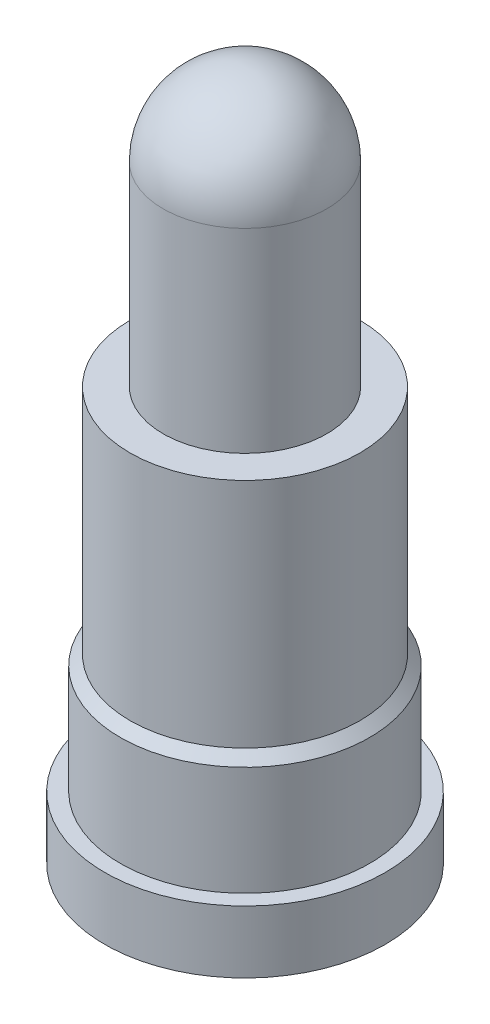
ISO-10303-21;
HEADER;
FILE_DESCRIPTION(('STEP AP214'),'2;1');
FILE_NAME('part.step','',(''),(''),'','','');
FILE_SCHEMA(('AUTOMOTIVE_DESIGN { 1 0 10303 214 1 1 1 1 }'));
ENDSEC;
DATA;
#1=APPLICATION_CONTEXT('core data for automotive mechanical design processes');
#2=APPLICATION_PROTOCOL_DEFINITION('international standard','automotive_design',2000,#1);
#3=PRODUCT_CONTEXT('',#1,'mechanical');
#4=PRODUCT('Part','Part','',(#3));
#5=PRODUCT_RELATED_PRODUCT_CATEGORY('part','',(#4));
#6=PRODUCT_DEFINITION_FORMATION('','',#4);
#7=PRODUCT_DEFINITION_CONTEXT('part definition',#1,'design');
#8=PRODUCT_DEFINITION('design','',#6,#7);
#9=PRODUCT_DEFINITION_SHAPE('','',#8);
#10=(LENGTH_UNIT() NAMED_UNIT(*) SI_UNIT(.MILLI.,.METRE.));
#11=(NAMED_UNIT(*) PLANE_ANGLE_UNIT() SI_UNIT($,.RADIAN.));
#12=(NAMED_UNIT(*) SI_UNIT($,.STERADIAN.) SOLID_ANGLE_UNIT());
#13=UNCERTAINTY_MEASURE_WITH_UNIT(LENGTH_MEASURE(1.E-05),#10,'distance_accuracy_value','');
#14=(GEOMETRIC_REPRESENTATION_CONTEXT(3) GLOBAL_UNCERTAINTY_ASSIGNED_CONTEXT((#13)) GLOBAL_UNIT_ASSIGNED_CONTEXT((#10,
#11,#12)) REPRESENTATION_CONTEXT('',''));
#15=CARTESIAN_POINT('',(0.,0.,0.));
#16=DIRECTION('',(0.,0.,1.));
#17=DIRECTION('',(1.,0.,0.));
#18=AXIS2_PLACEMENT_3D('',#15,#16,#17);
#19=CARTESIAN_POINT('',(0.,3.9624,0.));
#20=DIRECTION('',(0.,1.,0.));
#21=DIRECTION('',(-1.,0.,0.));
#22=AXIS2_PLACEMENT_3D('',#19,#20,#21);
#23=SPHERICAL_SURFACE('',#22,0.5334);
#24=CARTESIAN_POINT('',(0.,3.9624,0.));
#25=DIRECTION('',(0.,1.,0.));
#26=DIRECTION('',(-1.,0.,0.));
#27=AXIS2_PLACEMENT_3D('',#24,#25,#26);
#28=CIRCLE('',#27,0.533400000000001);
#29=CARTESIAN_POINT('',(-0.5334,3.9624,0.));
#30=VERTEX_POINT('',#29);
#31=EDGE_CURVE('E10',#30,#30,#28,.T.);
#32=ORIENTED_EDGE('',*,*,#31,.T.);
#33=EDGE_LOOP('',(#32));
#34=FACE_BOUND('',#33,.T.);
#35=ADVANCED_FACE('F36',(#34),#23,.T.);
#36=CARTESIAN_POINT('',(0.,3.9624,0.));
#37=DIRECTION('',(0.,1.,0.));
#38=DIRECTION('',(-1.,0.,0.));
#39=AXIS2_PLACEMENT_3D('',#36,#37,#38);
#40=CYLINDRICAL_SURFACE('',#39,0.533400000000001);
#41=ORIENTED_EDGE('',*,*,#31,.F.);
#42=EDGE_LOOP('',(#41));
#43=FACE_BOUND('',#42,.T.);
#44=CARTESIAN_POINT('',(0.,2.6924,0.));
#45=DIRECTION('',(0.,1.,0.));
#46=DIRECTION('',(-1.,0.,0.));
#47=AXIS2_PLACEMENT_3D('',#44,#45,#46);
#48=CIRCLE('',#47,0.533400000000001);
#49=CARTESIAN_POINT('',(-0.5334,2.6924,0.));
#50=VERTEX_POINT('',#49);
#51=EDGE_CURVE('E42',#50,#50,#48,.T.);
#52=ORIENTED_EDGE('',*,*,#51,.T.);
#53=EDGE_LOOP('',(#52));
#54=FACE_BOUND('',#53,.T.);
#55=ADVANCED_FACE('F80',(#43,#54),#40,.T.);
#56=CARTESIAN_POINT('',(0.,2.6924,0.));
#57=DIRECTION('',(0.,-1.,0.));
#58=DIRECTION('',(1.,0.,0.));
#59=AXIS2_PLACEMENT_3D('',#56,#57,#58);
#60=PLANE('',#59);
#61=ORIENTED_EDGE('',*,*,#51,.F.);
#62=EDGE_LOOP('',(#61));
#63=FACE_BOUND('',#62,.T.);
#64=CARTESIAN_POINT('',(0.,2.6924,0.));
#65=DIRECTION('',(0.,1.,0.));
#66=DIRECTION('',(-1.,0.,0.));
#67=AXIS2_PLACEMENT_3D('',#64,#65,#66);
#68=CIRCLE('',#67,0.7493);
#69=CARTESIAN_POINT('',(-0.7493,2.6924,0.));
#70=VERTEX_POINT('',#69);
#71=EDGE_CURVE('E46',#70,#70,#68,.T.);
#72=ORIENTED_EDGE('',*,*,#71,.T.);
#73=EDGE_LOOP('',(#72));
#74=FACE_BOUND('',#73,.T.);
#75=ADVANCED_FACE('F84',(#63,#74),#60,.F.);
#76=CARTESIAN_POINT('',(0.,3.9624,0.));
#77=DIRECTION('',(0.,1.,0.));
#78=DIRECTION('',(-1.,0.,0.));
#79=AXIS2_PLACEMENT_3D('',#76,#77,#78);
#80=CYLINDRICAL_SURFACE('',#79,0.7493);
#81=ORIENTED_EDGE('',*,*,#71,.F.);
#82=EDGE_LOOP('',(#81));
#83=FACE_BOUND('',#82,.T.);
#84=CARTESIAN_POINT('',(0.,1.1811,0.));
#85=DIRECTION('',(0.,1.,0.));
#86=DIRECTION('',(-1.,0.,0.));
#87=AXIS2_PLACEMENT_3D('',#84,#85,#86);
#88=CIRCLE('',#87,0.7493);
#89=CARTESIAN_POINT('',(-0.7493,1.1811,0.));
#90=VERTEX_POINT('',#89);
#91=EDGE_CURVE('E50',#90,#90,#88,.T.);
#92=ORIENTED_EDGE('',*,*,#91,.T.);
#93=EDGE_LOOP('',(#92));
#94=FACE_BOUND('',#93,.T.);
#95=ADVANCED_FACE('F89',(#83,#94),#80,.T.);
#96=CARTESIAN_POINT('',(0.,1.1176,0.));
#97=DIRECTION('',(0.,-1.,0.));
#98=DIRECTION('',(1.,0.,0.));
#99=AXIS2_PLACEMENT_3D('',#96,#97,#98);
#100=CONICAL_SURFACE('',#99,0.8128,0.785398163397447);
#101=ORIENTED_EDGE('',*,*,#91,.F.);
#102=EDGE_LOOP('',(#101));
#103=FACE_BOUND('',#102,.T.);
#104=CARTESIAN_POINT('',(0.,1.1176,0.));
#105=DIRECTION('',(0.,1.,0.));
#106=DIRECTION('',(-1.,0.,0.));
#107=AXIS2_PLACEMENT_3D('',#104,#105,#106);
#108=CIRCLE('',#107,0.8128);
#109=CARTESIAN_POINT('',(-0.8128,1.1176,0.));
#110=VERTEX_POINT('',#109);
#111=EDGE_CURVE('E55',#110,#110,#108,.T.);
#112=ORIENTED_EDGE('',*,*,#111,.T.);
#113=EDGE_LOOP('',(#112));
#114=FACE_BOUND('',#113,.T.);
#115=ADVANCED_FACE('F95',(#103,#114),#100,.T.);
#116=CARTESIAN_POINT('',(0.,3.9624,0.));
#117=DIRECTION('',(0.,1.,0.));
#118=DIRECTION('',(-1.,0.,0.));
#119=AXIS2_PLACEMENT_3D('',#116,#117,#118);
#120=CYLINDRICAL_SURFACE('',#119,0.8128);
#121=ORIENTED_EDGE('',*,*,#111,.F.);
#122=EDGE_LOOP('',(#121));
#123=FACE_BOUND('',#122,.T.);
#124=CARTESIAN_POINT('',(0.,0.4064,0.));
#125=DIRECTION('',(0.,1.,0.));
#126=DIRECTION('',(-1.,0.,0.));
#127=AXIS2_PLACEMENT_3D('',#124,#125,#126);
#128=CIRCLE('',#127,0.8128);
#129=CARTESIAN_POINT('',(-0.8128,0.4064,0.));
#130=VERTEX_POINT('',#129);
#131=EDGE_CURVE('E58',#130,#130,#128,.T.);
#132=ORIENTED_EDGE('',*,*,#131,.T.);
#133=EDGE_LOOP('',(#132));
#134=FACE_BOUND('',#133,.T.);
#135=ADVANCED_FACE('F99',(#123,#134),#120,.T.);
#136=CARTESIAN_POINT('',(0.,0.4064,0.));
#137=DIRECTION('',(0.,-1.,0.));
#138=DIRECTION('',(1.,0.,0.));
#139=AXIS2_PLACEMENT_3D('',#136,#137,#138);
#140=PLANE('',#139);
#141=ORIENTED_EDGE('',*,*,#131,.F.);
#142=EDGE_LOOP('',(#141));
#143=FACE_BOUND('',#142,.T.);
#144=CARTESIAN_POINT('',(0.,0.406399999999999,0.));
#145=DIRECTION('',(0.,1.,0.));
#146=DIRECTION('',(-1.,0.,0.));
#147=AXIS2_PLACEMENT_3D('',#144,#145,#146);
#148=CIRCLE('',#147,0.9144);
#149=CARTESIAN_POINT('',(-0.9144,0.4064,0.));
#150=VERTEX_POINT('',#149);
#151=EDGE_CURVE('E61',#150,#150,#148,.T.);
#152=ORIENTED_EDGE('',*,*,#151,.T.);
#153=EDGE_LOOP('',(#152));
#154=FACE_BOUND('',#153,.T.);
#155=ADVANCED_FACE('F76',(#143,#154),#140,.F.);
#156=CARTESIAN_POINT('',(0.,3.9624,0.));
#157=DIRECTION('',(0.,1.,0.));
#158=DIRECTION('',(-1.,0.,0.));
#159=AXIS2_PLACEMENT_3D('',#156,#157,#158);
#160=CYLINDRICAL_SURFACE('',#159,0.9144);
#161=ORIENTED_EDGE('',*,*,#151,.F.);
#162=EDGE_LOOP('',(#161));
#163=FACE_BOUND('',#162,.T.);
#164=CARTESIAN_POINT('',(0.,0.,0.));
#165=DIRECTION('',(0.,1.,0.));
#166=DIRECTION('',(-1.,0.,0.));
#167=AXIS2_PLACEMENT_3D('',#164,#165,#166);
#168=CIRCLE('',#167,0.9144);
#169=CARTESIAN_POINT('',(-0.9144,0.,0.));
#170=VERTEX_POINT('',#169);
#171=EDGE_CURVE('E64',#170,#170,#168,.T.);
#172=ORIENTED_EDGE('',*,*,#171,.T.);
#173=EDGE_LOOP('',(#172));
#174=FACE_BOUND('',#173,.T.);
#175=ADVANCED_FACE('F68',(#163,#174),#160,.T.);
#176=CARTESIAN_POINT('',(0.,0.,0.));
#177=DIRECTION('',(0.,1.,0.));
#178=DIRECTION('',(-1.,0.,0.));
#179=AXIS2_PLACEMENT_3D('',#176,#177,#178);
#180=PLANE('',#179);
#181=ORIENTED_EDGE('',*,*,#171,.F.);
#182=EDGE_LOOP('',(#181));
#183=FACE_BOUND('',#182,.T.);
#184=ADVANCED_FACE('F70',(#183),#180,.F.);
#185=CLOSED_SHELL('',(#35,#55,#75,#95,#115,#135,#155,#175,#184));
#186=MANIFOLD_SOLID_BREP('B2',#185);
#187=ADVANCED_BREP_SHAPE_REPRESENTATION('',(#18,#186),#14);
#188=SHAPE_DEFINITION_REPRESENTATION(#9,#187);
ENDSEC;
END-ISO-10303-21;
